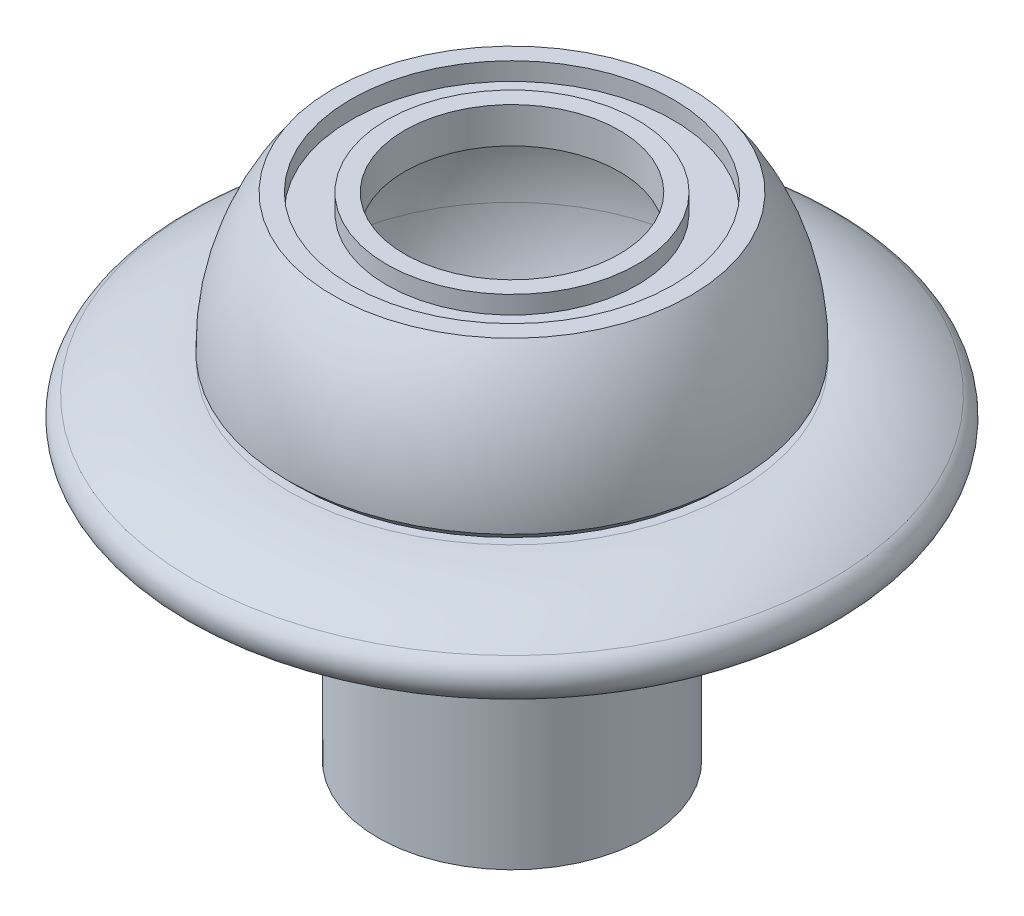
ISO-10303-21;
HEADER;
FILE_DESCRIPTION(('STEP AP214'),'2;1');
FILE_NAME('part.step','',(''),(''),'','','');
FILE_SCHEMA(('AUTOMOTIVE_DESIGN { 1 0 10303 214 1 1 1 1 }'));
ENDSEC;
DATA;
#1=APPLICATION_CONTEXT('core data for automotive mechanical design processes');
#2=APPLICATION_PROTOCOL_DEFINITION('international standard','automotive_design',2000,#1);
#3=PRODUCT_CONTEXT('',#1,'mechanical');
#4=PRODUCT('Part','Part','',(#3));
#5=PRODUCT_RELATED_PRODUCT_CATEGORY('part','',(#4));
#6=PRODUCT_DEFINITION_FORMATION('','',#4);
#7=PRODUCT_DEFINITION_CONTEXT('part definition',#1,'design');
#8=PRODUCT_DEFINITION('design','',#6,#7);
#9=PRODUCT_DEFINITION_SHAPE('','',#8);
#10=(LENGTH_UNIT() NAMED_UNIT(*) SI_UNIT(.MILLI.,.METRE.));
#11=(NAMED_UNIT(*) PLANE_ANGLE_UNIT() SI_UNIT($,.RADIAN.));
#12=(NAMED_UNIT(*) SI_UNIT($,.STERADIAN.) SOLID_ANGLE_UNIT());
#13=UNCERTAINTY_MEASURE_WITH_UNIT(LENGTH_MEASURE(1.E-05),#10,'distance_accuracy_value','');
#14=(GEOMETRIC_REPRESENTATION_CONTEXT(3) GLOBAL_UNCERTAINTY_ASSIGNED_CONTEXT((#13)) GLOBAL_UNIT_ASSIGNED_CONTEXT((#10,
#11,#12)) REPRESENTATION_CONTEXT('',''));
#15=CARTESIAN_POINT('',(0.,0.,0.));
#16=DIRECTION('',(0.,0.,1.));
#17=DIRECTION('',(1.,0.,0.));
#18=AXIS2_PLACEMENT_3D('',#15,#16,#17);
#19=CARTESIAN_POINT('',(0.,-1.49798647889359,0.));
#20=DIRECTION('',(0.,1.,0.));
#21=DIRECTION('',(0.,0.,1.));
#22=AXIS2_PLACEMENT_3D('',#19,#20,#21);
#23=PLANE('',#22);
#24=CARTESIAN_POINT('',(0.,-1.49798647889359,0.));
#25=DIRECTION('',(0.,1.,0.));
#26=DIRECTION('',(0.,0.,1.));
#27=AXIS2_PLACEMENT_3D('',#24,#25,#26);
#28=CIRCLE('',#27,23.9550803747263);
#29=CARTESIAN_POINT('',(0.,-1.49798647889359,23.9550803747263));
#30=VERTEX_POINT('',#29);
#31=EDGE_CURVE('E12',#30,#30,#28,.F.);
#32=ORIENTED_EDGE('',*,*,#31,.T.);
#33=EDGE_LOOP('',(#32));
#34=FACE_BOUND('',#33,.T.);
#35=CARTESIAN_POINT('',(0.,-1.49798647889359,0.));
#36=DIRECTION('',(0.,1.,0.));
#37=DIRECTION('',(0.,0.,1.));
#38=AXIS2_PLACEMENT_3D('',#35,#36,#37);
#39=CIRCLE('',#38,21.9489415806105);
#40=CARTESIAN_POINT('',(-21.9489415806105,-1.49798647889359,0.));
#41=VERTEX_POINT('',#40);
#42=EDGE_CURVE('E63',#41,#41,#39,.F.);
#43=ORIENTED_EDGE('',*,*,#42,.F.);
#44=EDGE_LOOP('',(#43));
#45=FACE_BOUND('',#44,.T.);
#46=ADVANCED_FACE('F52',(#34,#45),#23,.F.);
#47=CARTESIAN_POINT('',(0.,20.6981454974278,0.));
#48=DIRECTION('',(0.,1.,0.));
#49=DIRECTION('',(0.,0.,1.));
#50=AXIS2_PLACEMENT_3D('',#47,#48,#49);
#51=CYLINDRICAL_SURFACE('',#50,14.);
#52=CARTESIAN_POINT('',(0.,15.,0.));
#53=DIRECTION('',(0.,1.,0.));
#54=DIRECTION('',(-1.,0.,0.));
#55=AXIS2_PLACEMENT_3D('',#52,#53,#54);
#56=CIRCLE('',#55,14.);
#57=CARTESIAN_POINT('',(-14.,15.,0.));
#58=VERTEX_POINT('',#57);
#59=EDGE_CURVE('E70',#58,#58,#56,.F.);
#60=ORIENTED_EDGE('',*,*,#59,.T.);
#61=EDGE_LOOP('',(#60));
#62=FACE_BOUND('',#61,.T.);
#63=CARTESIAN_POINT('',(0.,13.,0.));
#64=DIRECTION('',(0.,1.,0.));
#65=DIRECTION('',(0.,0.,1.));
#66=AXIS2_PLACEMENT_3D('',#63,#64,#65);
#67=CIRCLE('',#66,14.);
#68=CARTESIAN_POINT('',(0.,13.,14.));
#69=VERTEX_POINT('',#68);
#70=EDGE_CURVE('E84',#69,#69,#67,.T.);
#71=ORIENTED_EDGE('',*,*,#70,.T.);
#72=EDGE_LOOP('',(#71));
#73=FACE_BOUND('',#72,.T.);
#74=ADVANCED_FACE('F104',(#62,#73),#51,.T.);
#75=CARTESIAN_POINT('',(-18.,13.,0.));
#76=DIRECTION('',(0.,-1.,0.));
#77=DIRECTION('',(0.,0.,-1.));
#78=AXIS2_PLACEMENT_3D('',#75,#76,#77);
#79=PLANE('',#78);
#80=ORIENTED_EDGE('',*,*,#70,.F.);
#81=EDGE_LOOP('',(#80));
#82=FACE_BOUND('',#81,.T.);
#83=CARTESIAN_POINT('',(0.,13.,0.));
#84=DIRECTION('',(0.,1.,0.));
#85=DIRECTION('',(0.,0.,1.));
#86=AXIS2_PLACEMENT_3D('',#83,#84,#85);
#87=CIRCLE('',#86,18.);
#88=CARTESIAN_POINT('',(0.,13.,18.));
#89=VERTEX_POINT('',#88);
#90=EDGE_CURVE('E77',#89,#89,#87,.T.);
#91=ORIENTED_EDGE('',*,*,#90,.T.);
#92=EDGE_LOOP('',(#91));
#93=FACE_BOUND('',#92,.T.);
#94=ADVANCED_FACE('F107',(#82,#93),#79,.F.);
#95=CARTESIAN_POINT('',(0.,20.6981454974278,0.));
#96=DIRECTION('',(0.,1.,0.));
#97=DIRECTION('',(0.,0.,1.));
#98=AXIS2_PLACEMENT_3D('',#95,#96,#97);
#99=CYLINDRICAL_SURFACE('',#98,18.);
#100=CARTESIAN_POINT('',(0.,15.,0.));
#101=DIRECTION('',(0.,1.,0.));
#102=DIRECTION('',(-1.,0.,0.));
#103=AXIS2_PLACEMENT_3D('',#100,#101,#102);
#104=CIRCLE('',#103,18.);
#105=CARTESIAN_POINT('',(-18.,15.,0.));
#106=VERTEX_POINT('',#105);
#107=EDGE_CURVE('E74',#106,#106,#104,.T.);
#108=ORIENTED_EDGE('',*,*,#107,.T.);
#109=EDGE_LOOP('',(#108));
#110=FACE_BOUND('',#109,.T.);
#111=ORIENTED_EDGE('',*,*,#90,.F.);
#112=EDGE_LOOP('',(#111));
#113=FACE_BOUND('',#112,.T.);
#114=ADVANCED_FACE('F113',(#110,#113),#99,.F.);
#115=CARTESIAN_POINT('',(-20.,15.,0.));
#116=DIRECTION('',(0.,1.,0.));
#117=DIRECTION('',(-1.,0.,0.));
#118=AXIS2_PLACEMENT_3D('',#115,#116,#117);
#119=PLANE('',#118);
#120=ORIENTED_EDGE('',*,*,#107,.F.);
#121=EDGE_LOOP('',(#120));
#122=FACE_BOUND('',#121,.T.);
#123=CARTESIAN_POINT('',(0.,15.,0.));
#124=DIRECTION('',(0.,1.,0.));
#125=DIRECTION('',(-1.,0.,0.));
#126=AXIS2_PLACEMENT_3D('',#123,#124,#125);
#127=CIRCLE('',#126,20.);
#128=CARTESIAN_POINT('',(-20.,15.,0.));
#129=VERTEX_POINT('',#128);
#130=EDGE_CURVE('E67',#129,#129,#127,.T.);
#131=ORIENTED_EDGE('',*,*,#130,.T.);
#132=EDGE_LOOP('',(#131));
#133=FACE_BOUND('',#132,.T.);
#134=ADVANCED_FACE('F101',(#122,#133),#119,.T.);
#135=CARTESIAN_POINT('',(0.,0.,0.));
#136=DIRECTION('',(0.,1.,0.));
#137=DIRECTION('',(-1.,0.,0.));
#138=AXIS2_PLACEMENT_3D('',#135,#136,#137);
#139=SPHERICAL_SURFACE('',#138,25.);
#140=CARTESIAN_POINT('',(0.,-0.457248731429853,0.));
#141=DIRECTION('',(0.,1.,0.));
#142=DIRECTION('',(0.,0.,1.));
#143=AXIS2_PLACEMENT_3D('',#140,#141,#142);
#144=CIRCLE('',#143,24.9958181221901);
#145=CARTESIAN_POINT('',(-24.9958181221901,-0.457248731429853,0.));
#146=VERTEX_POINT('',#145);
#147=EDGE_CURVE('E59',#146,#146,#144,.T.);
#148=CARTESIAN_POINT('',(-24.9958181221901,-0.457248731429853,0.));
#149=CARTESIAN_POINT('',(-24.9989705166182,-0.284935872463204,0.));
#150=CARTESIAN_POINT('',(-25.0003405721152,-0.112590418959888,0.));
#151=CARTESIAN_POINT('',(-24.9995166214743,0.232091969804561,0.));
#152=CARTESIAN_POINT('',(-24.9973226153363,0.404428905065694,0.));
#153=CARTESIAN_POINT('',(-24.9893711576524,0.74902055003026,0.));
#154=CARTESIAN_POINT('',(-24.9836137061064,0.921275259733693,0.));
#155=CARTESIAN_POINT('',(-24.9685379063162,1.26562878241046,0.));
#156=CARTESIAN_POINT('',(-24.9592195580718,1.43772759538379,0.));
#157=CARTESIAN_POINT('',(-24.9370259271086,1.78169571984165,0.));
#158=CARTESIAN_POINT('',(-24.9241506443898,1.95356503132617,0.));
#159=CARTESIAN_POINT('',(-24.8948486572865,2.29700064627295,0.));
#160=CARTESIAN_POINT('',(-24.878421952902,2.46856694973521,0.));
#161=CARTESIAN_POINT('',(-24.8420241463216,2.81132317167833,0.));
#162=CARTESIAN_POINT('',(-24.8220530441255,2.98251309015918,0.));
#163=CARTESIAN_POINT('',(-24.7785749837799,3.32444332616094,0.));
#164=CARTESIAN_POINT('',(-24.7550680256303,3.49518364368184,0.));
#165=CARTESIAN_POINT('',(-24.7045283069167,3.83614165407302,0.));
#166=CARTESIAN_POINT('',(-24.6774955463528,4.0063593469433,0.));
#167=CARTESIAN_POINT('',(-24.6199157844465,4.34619930786352,0.));
#168=CARTESIAN_POINT('',(-24.5893687831041,4.51582157591346,0.));
#169=CARTESIAN_POINT('',(-24.5247736042372,4.85439814167964,0.));
#170=CARTESIAN_POINT('',(-24.4907254267126,5.02335243939588,0.));
#171=CARTESIAN_POINT('',(-24.4191424575016,5.36052080466459,0.));
#172=CARTESIAN_POINT('',(-24.3816076658151,5.52873487221707,0.));
#173=CARTESIAN_POINT('',(-24.3030675214828,5.86435083391623,0.));
#174=CARTESIAN_POINT('',(-24.262062168837,6.03175272806292,0.));
#175=CARTESIAN_POINT('',(-24.1765984401087,6.36567274706578,0.));
#176=CARTESIAN_POINT('',(-24.1321400640263,6.53219087192196,0.));
#177=CARTESIAN_POINT('',(-24.0397893027662,6.86427213443716,0.));
#178=CARTESIAN_POINT('',(-23.9918969175886,7.02983527209618,0.));
#179=CARTESIAN_POINT('',(-23.8926986211661,7.35993575074757,0.));
#180=CARTESIAN_POINT('',(-23.8413927099213,7.52447309173994,0.));
#181=CARTESIAN_POINT('',(-23.7353893043186,7.8524516063101,0.));
#182=CARTESIAN_POINT('',(-23.6806918099608,8.01589277988788,0.));
#183=CARTESIAN_POINT('',(-23.5679286316281,8.34160905769926,0.));
#184=CARTESIAN_POINT('',(-23.5098629476531,8.50388416193286,0.));
#185=CARTESIAN_POINT('',(-23.3903882241181,8.82719889784082,0.));
#186=CARTESIAN_POINT('',(-23.3289791845581,8.98823852951519,0.));
#187=CARTESIAN_POINT('',(-23.2028440138002,9.30901344548726,0.));
#188=CARTESIAN_POINT('',(-23.1381178826023,9.46874872978496,0.));
#189=CARTESIAN_POINT('',(-23.0053762111983,9.78684663404065,0.));
#190=CARTESIAN_POINT('',(-22.9373606709922,9.94520925399864,0.));
#191=CARTESIAN_POINT('',(-22.7980692710443,10.2604940996852,0.));
#192=CARTESIAN_POINT('',(-22.7267934113027,10.4174163254138,0.));
#193=CARTESIAN_POINT('',(-22.581011856156,10.7297532687905,0.));
#194=CARTESIAN_POINT('',(-22.506506160751,10.8851679864386,0.));
#195=CARTESIAN_POINT('',(-22.3542967995223,11.1944234445534,0.));
#196=CARTESIAN_POINT('',(-22.2765931336987,11.3482641850202,0.));
#197=CARTESIAN_POINT('',(-22.1180210645804,11.6543058928201,0.));
#198=CARTESIAN_POINT('',(-22.0371526612857,11.8065068601533,0.));
#199=CARTESIAN_POINT('',(-21.8722857038177,12.1092039271342,0.));
#200=CARTESIAN_POINT('',(-21.7882871496444,12.259700026782,0.));
#201=CARTESIAN_POINT('',(-21.6171958152833,12.5589229926639,0.));
#202=CARTESIAN_POINT('',(-21.5301030350955,12.7076498588979,0.));
#203=CARTESIAN_POINT('',(-21.3528604986449,13.003270750133,0.));
#204=CARTESIAN_POINT('',(-21.2627107423821,13.1501647751341,0.));
#205=CARTESIAN_POINT('',(-21.0793928047727,13.4420571553858,0.));
#206=CARTESIAN_POINT('',(-20.9862246234261,13.5870555106365,0.));
#207=CARTESIAN_POINT('',(-20.7969097014048,13.8750945507323,0.));
#208=CARTESIAN_POINT('',(-20.7007629607302,14.0181352355774,0.));
#209=CARTESIAN_POINT('',(-20.5055319708127,14.3021977076403,0.));
#210=CARTESIAN_POINT('',(-20.4064477215699,14.4432194948582,0.));
#211=CARTESIAN_POINT('',(-20.2053843533636,14.7231840461581,0.));
#212=CARTESIAN_POINT('',(-20.1034052344001,14.8621268102401,0.));
#213=CARTESIAN_POINT('',(-20.,15.,0.));
#214=B_SPLINE_CURVE_WITH_KNOTS('',3,(#148,#149,#150,#151,#152,#153,#154,#155,#156,#157,#158,
#159,#160,#161,#162,#163,#164,#165,#166,#167,#168,#169,#170,#171,#172,#173,#174,#175,#176,#177,
#178,#179,#180,#181,#182,#183,#184,#185,#186,#187,#188,#189,#190,#191,#192,#193,#194,#195,#196,
#197,#198,#199,#200,#201,#202,#203,#204,#205,#206,#207,#208,#209,#210,#211,#212,#213),
.UNSPECIFIED.,.F.,.F.,(4,2,2,2,2,2,2,2,2,2,2,2,2,2,2,2,2,2,2,2,2,2,2,2,2,2,2,2,2,2,2,2,4),(0.,
0.517015847036513,1.03403169407303,1.55104754110954,2.06806338814605,2.58507923518256,
3.10209508221908,3.61911092925559,4.1361267762921,4.65314262332862,5.17015847036513,
5.68717431740164,6.20419016443816,6.72120601147467,7.23822185851118,7.75523770554769,
8.27225355258421,8.78926939962072,9.30628524665723,9.82330109369375,10.3403169407303,
10.8573327877668,11.3743486348033,11.8913644818398,12.4083803288763,12.9253961759128,
13.4424120229493,13.9594278699858,14.4764437170224,14.9934595640589,15.5104754110954,
16.0274912581319,16.5445071051684),.UNSPECIFIED.);
#215=EDGE_CURVE('BSEAM99',#146,#129,#214,.T.);
#216=ORIENTED_EDGE('',*,*,#147,.T.);
#217=ORIENTED_EDGE('',*,*,#130,.F.);
#218=ORIENTED_EDGE('',*,*,#215,.T.);
#219=ORIENTED_EDGE('',*,*,#215,.F.);
#220=EDGE_LOOP('',(#216,#218,#217,#219));
#221=FACE_BOUND('',#220,.T.);
#222=ADVANCED_FACE('F99',(#221),#139,.T.);
#223=CARTESIAN_POINT('',(0.,15.,0.));
#224=DIRECTION('',(0.,1.,0.));
#225=DIRECTION('',(-1.,0.,0.));
#226=AXIS2_PLACEMENT_3D('',#223,#224,#225);
#227=CIRCLE('',#226,12.);
#228=CARTESIAN_POINT('',(-12.,15.,0.));
#229=VERTEX_POINT('',#228);
#230=EDGE_CURVE('E90',#229,#229,#227,.T.);
#231=ORIENTED_EDGE('',*,*,#230,.F.);
#232=EDGE_LOOP('',(#231));
#233=FACE_BOUND('',#232,.T.);
#234=ORIENTED_EDGE('',*,*,#59,.F.);
#235=EDGE_LOOP('',(#234));
#236=FACE_BOUND('',#235,.T.);
#237=ADVANCED_FACE('F96',(#233,#236),#119,.T.);
#238=CARTESIAN_POINT('',(0.,-22.9411254969543,0.));
#239=DIRECTION('',(0.,1.,0.));
#240=DIRECTION('',(-1.,0.,0.));
#241=AXIS2_PLACEMENT_3D('',#238,#239,#240);
#242=CYLINDRICAL_SURFACE('',#241,12.);
#243=CARTESIAN_POINT('',(0.,11.,0.));
#244=DIRECTION('',(0.,1.,0.));
#245=DIRECTION('',(-1.,0.,0.));
#246=AXIS2_PLACEMENT_3D('',#243,#244,#245);
#247=CIRCLE('',#246,12.);
#248=CARTESIAN_POINT('',(-12.,11.,0.));
#249=VERTEX_POINT('',#248);
#250=EDGE_CURVE('E87',#249,#249,#247,.F.);
#251=ORIENTED_EDGE('',*,*,#250,.T.);
#252=EDGE_LOOP('',(#251));
#253=FACE_BOUND('',#252,.T.);
#254=ORIENTED_EDGE('',*,*,#230,.T.);
#255=EDGE_LOOP('',(#254));
#256=FACE_BOUND('',#255,.T.);
#257=ADVANCED_FACE('F94',(#253,#256),#242,.F.);
#258=CARTESIAN_POINT('',(-20.,11.,0.));
#259=DIRECTION('',(0.,1.,0.));
#260=DIRECTION('',(-1.,0.,0.));
#261=AXIS2_PLACEMENT_3D('',#258,#259,#260);
#262=PLANE('',#261);
#263=ORIENTED_EDGE('',*,*,#250,.F.);
#264=EDGE_LOOP('',(#263));
#265=FACE_BOUND('',#264,.T.);
#266=CARTESIAN_POINT('',(0.,11.,0.));
#267=DIRECTION('',(0.,1.,0.));
#268=DIRECTION('',(-1.,0.,0.));
#269=AXIS2_PLACEMENT_3D('',#266,#267,#268);
#270=CIRCLE('',#269,19.0525588832577);
#271=CARTESIAN_POINT('',(-19.0525588832577,11.,0.));
#272=VERTEX_POINT('',#271);
#273=EDGE_CURVE('E73',#272,#272,#270,.T.);
#274=ORIENTED_EDGE('',*,*,#273,.F.);
#275=EDGE_LOOP('',(#274));
#276=FACE_BOUND('',#275,.T.);
#277=ADVANCED_FACE('F130',(#265,#276),#262,.F.);
#278=CARTESIAN_POINT('',(0.,0.,0.));
#279=DIRECTION('',(0.,1.,0.));
#280=DIRECTION('',(-1.,0.,0.));
#281=AXIS2_PLACEMENT_3D('',#278,#279,#280);
#282=SPHERICAL_SURFACE('',#281,22.);
#283=CARTESIAN_POINT('',(-21.9489415806105,-1.49798647889359,0.));
#284=CARTESIAN_POINT('',(-21.9581752886266,-1.3626937149652,0.));
#285=CARTESIAN_POINT('',(-21.9661577823366,-1.22731556224396,0.));
#286=CARTESIAN_POINT('',(-21.9796182870077,-0.956434804223561,0.));
#287=CARTESIAN_POINT('',(-21.9850962979688,-0.820932198924397,0.));
#288=CARTESIAN_POINT('',(-21.9935457830053,-0.549848860755922,0.));
#289=CARTESIAN_POINT('',(-21.9965172570808,-0.41426812788661,0.));
#290=CARTESIAN_POINT('',(-21.9999527007673,-0.143074897703416,0.));
#291=CARTESIAN_POINT('',(-22.0004166703784,-0.00746240038953348,0.));
#292=CARTESIAN_POINT('',(-21.9988369334921,0.263747987750982,0.));
#293=CARTESIAN_POINT('',(-21.9967932269947,0.399345878577615,0.));
#294=CARTESIAN_POINT('',(-21.9901988402018,0.670480686987703,0.));
#295=CARTESIAN_POINT('',(-21.9856481599062,0.806017604571159,0.));
#296=CARTESIAN_POINT('',(-21.9740413806515,1.07698412080762,0.));
#297=CARTESIAN_POINT('',(-21.9669852816925,1.21241371946064,0.));
#298=CARTESIAN_POINT('',(-21.9503700781359,1.48311928878699,0.));
#299=CARTESIAN_POINT('',(-21.9408109735383,1.61839525946034,0.));
#300=CARTESIAN_POINT('',(-21.9191930272949,1.88874731632572,0.));
#301=CARTESIAN_POINT('',(-21.907134185649,2.02382340251776,0.));
#302=CARTESIAN_POINT('',(-21.8805208887485,2.29372950226351,0.));
#303=CARTESIAN_POINT('',(-21.8659664334939,2.42855951581723,0.));
#304=CARTESIAN_POINT('',(-21.8343668861474,2.69792736627296,0.));
#305=CARTESIAN_POINT('',(-21.8173217940555,2.83246520317498,0.));
#306=CARTESIAN_POINT('',(-21.7807468014646,3.10120269622106,0.));
#307=CARTESIAN_POINT('',(-21.7612169009656,3.23540235236512,0.));
#308=CARTESIAN_POINT('',(-21.719678969649,3.50341759542722,0.));
#309=CARTESIAN_POINT('',(-21.6976709388314,3.63723318234525,0.));
#310=CARTESIAN_POINT('',(-21.6511842723427,3.90443452981653,0.));
#311=CARTESIAN_POINT('',(-21.6267056366716,4.03782029036977,0.));
#312=CARTESIAN_POINT('',(-21.5752861307438,4.30411637494828,0.));
#313=CARTESIAN_POINT('',(-21.5483452604871,4.43702669897355,0.));
#314=CARTESIAN_POINT('',(-21.4920104975973,4.70232646290454,0.));
#315=CARTESIAN_POINT('',(-21.462616604964,4.83471590281027,0.));
#316=CARTESIAN_POINT('',(-21.4013858483206,5.09892862902264,0.));
#317=CARTESIAN_POINT('',(-21.3695489843104,5.23075191532929,0.));
#318=CARTESIAN_POINT('',(-21.3034431712668,5.49378725845554,0.));
#319=CARTESIAN_POINT('',(-21.2691742222334,5.62499931527515,0.));
#320=CARTESIAN_POINT('',(-21.1982159571284,5.88676733254424,0.));
#321=CARTESIAN_POINT('',(-21.1615266410568,6.01732329299372,0.));
#322=CARTESIAN_POINT('',(-21.0857401874853,6.27773447498626,0.));
#323=CARTESIAN_POINT('',(-21.0466430499853,6.40758969652932,0.));
#324=CARTESIAN_POINT('',(-20.9660543225013,6.66655499778453,0.));
#325=CARTESIAN_POINT('',(-20.9245627325173,6.7956650774967,0.));
#326=CARTESIAN_POINT('',(-20.8391992877732,7.053095946961,0.));
#327=CARTESIAN_POINT('',(-20.7953274330132,7.18141673671314,0.));
#328=CARTESIAN_POINT('',(-20.7052184603358,7.43722514801867,0.));
#329=CARTESIAN_POINT('',(-20.6589813424183,7.56471276957207,0.));
#330=CARTESIAN_POINT('',(-20.5641576538322,7.81881125113936,0.));
#331=CARTESIAN_POINT('',(-20.5155710831636,7.94542211115326,0.));
#332=CARTESIAN_POINT('',(-20.4160651028374,8.19772377609118,0.));
#333=CARTESIAN_POINT('',(-20.3651456931798,8.32341458101519,0.));
#334=CARTESIAN_POINT('',(-20.2609914464075,8.57383315686937,0.));
#335=CARTESIAN_POINT('',(-20.2077566092928,8.69856092779953,0.));
#336=CARTESIAN_POINT('',(-20.0989897106017,8.94701078591002,0.));
#337=CARTESIAN_POINT('',(-20.0434576490254,9.07073287309034,0.));
#338=CARTESIAN_POINT('',(-19.9301152909598,9.31712905840354,0.));
#339=CARTESIAN_POINT('',(-19.8723049944707,9.43980315653641,0.));
#340=CARTESIAN_POINT('',(-19.7544259312841,9.68406141466953,0.));
#341=CARTESIAN_POINT('',(-19.6943571645868,9.80564557466977,0.));
#342=CARTESIAN_POINT('',(-19.5719817123892,10.0476823881299,0.));
#343=CARTESIAN_POINT('',(-19.509675026889,10.1681350415899,0.));
#344=CARTESIAN_POINT('',(-19.382844999855,10.4078676306814,0.));
#345=CARTESIAN_POINT('',(-19.3183216583213,10.5271475663129,0.));
#346=CARTESIAN_POINT('',(-19.1870805410174,10.7644940206377,0.));
#347=CARTESIAN_POINT('',(-19.1203627652473,10.8825605393309,0.));
#348=CARTESIAN_POINT('',(-19.0525588832577,11.,0.));
#349=B_SPLINE_CURVE_WITH_KNOTS('',3,(#283,#284,#285,#286,#287,#288,#289,#290,#291,#292,#293,
#294,#295,#296,#297,#298,#299,#300,#301,#302,#303,#304,#305,#306,#307,#308,#309,#310,#311,#312,
#313,#314,#315,#316,#317,#318,#319,#320,#321,#322,#323,#324,#325,#326,#327,#328,#329,#330,#331,
#332,#333,#334,#335,#336,#337,#338,#339,#340,#341,#342,#343,#344,#345,#346,#347,#348),
.UNSPECIFIED.,.F.,.F.,(4,2,2,2,2,2,2,2,2,2,2,2,2,2,2,2,2,2,2,2,2,2,2,2,2,2,2,2,2,2,2,2,4),(0.,
0.406816687372371,0.813633374744741,1.22045006211711,1.62726674948948,2.03408343686185,
2.44090012423422,2.8477168116066,3.25453349897897,3.66135018635134,4.06816687372371,
4.47498356109608,4.88180024846845,5.28861693584082,5.69543362321319,6.10225031058556,
6.50906699795793,6.9158836853303,7.32270037270267,7.72951706007504,8.13633374744741,
8.54315043481978,8.94996712219215,9.35678380956453,9.7636004969369,10.1704171843093,
10.5772338716816,10.984050559054,11.3908672464264,11.7976839337987,12.2045006211711,
12.6113173085435,13.0181339959159),.UNSPECIFIED.);
#350=EDGE_CURVE('BSEAM125',#41,#272,#349,.T.);
#351=ORIENTED_EDGE('',*,*,#42,.T.);
#352=ORIENTED_EDGE('',*,*,#273,.T.);
#353=ORIENTED_EDGE('',*,*,#350,.T.);
#354=ORIENTED_EDGE('',*,*,#350,.F.);
#355=EDGE_LOOP('',(#351,#353,#352,#354));
#356=FACE_BOUND('',#355,.T.);
#357=ADVANCED_FACE('F125',(#356),#282,.F.);
#358=CARTESIAN_POINT('',(0.,-0.457248731429853,0.));
#359=DIRECTION('',(0.,1.,0.));
#360=DIRECTION('',(0.,0.,1.));
#361=AXIS2_PLACEMENT_3D('',#358,#359,#360);
#362=CONICAL_SURFACE('',#361,24.9958181221901,0.785398163397453);
#363=ORIENTED_EDGE('',*,*,#31,.F.);
#364=EDGE_LOOP('',(#363));
#365=FACE_BOUND('',#364,.T.);
#366=ORIENTED_EDGE('',*,*,#147,.F.);
#367=EDGE_LOOP('',(#366));
#368=FACE_BOUND('',#367,.T.);
#369=ADVANCED_FACE('F54',(#365,#368),#362,.T.);
#370=CLOSED_SHELL('',(#46,#74,#94,#114,#134,#222,#237,#257,#277,#357,#369));
#371=MANIFOLD_SOLID_BREP('B2',#370);
#372=CARTESIAN_POINT('',(0.,-1.49798647889359,0.));
#373=DIRECTION('',(0.,1.,0.));
#374=DIRECTION('',(0.,0.,1.));
#375=AXIS2_PLACEMENT_3D('',#372,#373,#374);
#376=PLANE('',#375);
#377=CARTESIAN_POINT('',(0.,-1.49798647889359,0.));
#378=DIRECTION('',(0.,1.,0.));
#379=DIRECTION('',(0.,0.,1.));
#380=AXIS2_PLACEMENT_3D('',#377,#378,#379);
#381=CIRCLE('',#380,21.9489415806105);
#382=CARTESIAN_POINT('',(-21.9489415806105,-1.49798647889359,0.));
#383=VERTEX_POINT('',#382);
#384=EDGE_CURVE('E233',#383,#383,#381,.F.);
#385=ORIENTED_EDGE('',*,*,#384,.T.);
#386=EDGE_LOOP('',(#385));
#387=FACE_BOUND('',#386,.T.);
#388=CARTESIAN_POINT('',(0.,-1.49798647889359,0.));
#389=DIRECTION('',(0.,1.,0.));
#390=DIRECTION('',(0.,0.,1.));
#391=AXIS2_PLACEMENT_3D('',#388,#389,#390);
#392=CIRCLE('',#391,24.9550803747263);
#393=CARTESIAN_POINT('',(0.,-1.49798647889359,24.9550803747263));
#394=VERTEX_POINT('',#393);
#395=EDGE_CURVE('E221',#394,#394,#392,.T.);
#396=ORIENTED_EDGE('',*,*,#395,.T.);
#397=EDGE_LOOP('',(#396));
#398=FACE_BOUND('',#397,.T.);
#399=ADVANCED_FACE('F217',(#387,#398),#376,.T.);
#400=CARTESIAN_POINT('',(0.,0.,0.));
#401=DIRECTION('',(0.,1.,0.));
#402=DIRECTION('',(-1.,0.,0.));
#403=AXIS2_PLACEMENT_3D('',#400,#401,#402);
#404=SPHERICAL_SURFACE('',#403,22.);
#405=CARTESIAN_POINT('',(0.,-18.4390889145858,0.));
#406=DIRECTION('',(0.,1.,0.));
#407=DIRECTION('',(-1.,0.,0.));
#408=AXIS2_PLACEMENT_3D('',#405,#406,#407);
#409=CIRCLE('',#408,12.);
#410=CARTESIAN_POINT('',(-12.,-18.4390889145858,0.));
#411=VERTEX_POINT('',#410);
#412=EDGE_CURVE('E268',#411,#411,#409,.T.);
#413=CARTESIAN_POINT('',(-12.,-18.4390889145858,0.));
#414=CARTESIAN_POINT('',(-12.177807499258,-18.3233744277765,0.));
#415=CARTESIAN_POINT('',(-12.3539402199147,-18.2050865763757,0.));
#416=CARTESIAN_POINT('',(-12.7027110194208,-17.9634664589658,0.));
#417=CARTESIAN_POINT('',(-12.8753490982701,-17.8401341929566,0.));
#418=CARTESIAN_POINT('',(-13.2169855295567,-17.5885275609046,0.));
#419=CARTESIAN_POINT('',(-13.3859838819939,-17.4602531948618,0.));
#420=CARTESIAN_POINT('',(-13.7201996052237,-17.1988699440362,0.));
#421=CARTESIAN_POINT('',(-13.8854169760164,-17.0657610592535,0.));
#422=CARTESIAN_POINT('',(-14.2119324347566,-16.7948200947807,0.));
#423=CARTESIAN_POINT('',(-14.3732305227041,-16.6569880150906,0.));
#424=CARTESIAN_POINT('',(-14.6917724505377,-16.376716018297,0.));
#425=CARTESIAN_POINT('',(-14.8490162904238,-16.2342761011934,0.));
#426=CARTESIAN_POINT('',(-15.1593181345106,-15.9449076212272,0.));
#427=CARTESIAN_POINT('',(-15.3123761387112,-15.7979790583647,0.));
#428=CARTESIAN_POINT('',(-15.614178230624,-15.4997562405439,0.));
#429=CARTESIAN_POINT('',(-15.7629223183362,-15.3484619855858,0.));
#430=CARTESIAN_POINT('',(-16.0559721053484,-15.0416343889639,0.));
#431=CARTESIAN_POINT('',(-16.2002778046485,-14.8861010473001,0.));
#432=CARTESIAN_POINT('',(-16.4843300573254,-14.5709254304183,0.));
#433=CARTESIAN_POINT('',(-16.6240766107022,-14.4112831552003,0.));
#434=CARTESIAN_POINT('',(-16.8988936291179,-14.0880232626783,0.));
#435=CARTESIAN_POINT('',(-17.0339640941568,-13.9244056453741,0.));
#436=CARTESIAN_POINT('',(-17.2993159065367,-13.5933319868146,0.));
#437=CARTESIAN_POINT('',(-17.4295972538777,-13.4258759455592,0.));
#438=CARTESIAN_POINT('',(-17.6852618091149,-13.0872655692853,0.));
#439=CARTESIAN_POINT('',(-17.8106450170111,-12.9161112342667,0.));
#440=CARTESIAN_POINT('',(-18.0564083704634,-12.5702474954548,0.));
#441=CARTESIAN_POINT('',(-18.1767885160196,-12.3955380916615,0.));
#442=CARTESIAN_POINT('',(-18.4124450085476,-12.0427104152322,0.));
#443=CARTESIAN_POINT('',(-18.5277213555195,-11.8645921425964,0.));
#444=CARTESIAN_POINT('',(-18.7530737855841,-11.5050957810167,0.));
#445=CARTESIAN_POINT('',(-18.8631498686769,-11.3237176920729,0.));
#446=CARTESIAN_POINT('',(-19.0780096573618,-10.957853478284,0.));
#447=CARTESIAN_POINT('',(-19.1827933629539,-10.7733673534389,0.));
#448=CARTESIAN_POINT('',(-19.3869807117712,-10.4014414491139,0.));
#449=CARTESIAN_POINT('',(-19.4863843549964,-10.2140016696339,0.));
#450=CARTESIAN_POINT('',(-19.6797283963456,-9.83632530897591,0.));
#451=CARTESIAN_POINT('',(-19.7736687944695,-9.64608872779798,0.));
#452=CARTESIAN_POINT('',(-19.9560077346225,-9.26297795709455,0.));
#453=CARTESIAN_POINT('',(-20.0444062766515,-9.07010376756904,0.));
#454=CARTESIAN_POINT('',(-20.2155875311438,-8.68187918071828,0.));
#455=CARTESIAN_POINT('',(-20.2983702436071,-8.48652878339302,0.));
#456=CARTESIAN_POINT('',(-20.4582505649257,-8.09351525362547,0.));
#457=CARTESIAN_POINT('',(-20.5353481737811,-7.89585212118319,0.));
#458=CARTESIAN_POINT('',(-20.6837937712275,-7.49837852920121,0.));
#459=CARTESIAN_POINT('',(-20.7551417598187,-7.29856806966151,0.));
#460=CARTESIAN_POINT('',(-20.8920284115012,-6.89696702842933,0.));
#461=CARTESIAN_POINT('',(-20.9575670745925,-6.69517644673684,0.));
#462=CARTESIAN_POINT('',(-21.082780231251,-6.28978402313185,0.));
#463=CARTESIAN_POINT('',(-21.1424547248181,-6.08618218121935,0.));
#464=CARTESIAN_POINT('',(-21.2558896061514,-5.67733761485121,0.));
#465=CARTESIAN_POINT('',(-21.3096499939177,-5.47209489039556,0.));
#466=CARTESIAN_POINT('',(-21.4112116745102,-5.06014030955344,0.));
#467=CARTESIAN_POINT('',(-21.4590129673364,-4.85342845316697,0.));
#468=CARTESIAN_POINT('',(-21.5486164626454,-4.43870858915867,0.));
#469=CARTESIAN_POINT('',(-21.5904186651283,-4.23070058153684,0.));
#470=CARTESIAN_POINT('',(-21.6679889781462,-3.81356247783009,0.));
#471=CARTESIAN_POINT('',(-21.7037570886812,-3.60443238174516,0.));
#472=CARTESIAN_POINT('',(-21.769229363961,-3.1852251124429,0.));
#473=CARTESIAN_POINT('',(-21.7989335287058,-2.97514793922555,0.));
#474=CARTESIAN_POINT('',(-21.8522527660201,-2.55422228378628,0.));
#475=CARTESIAN_POINT('',(-21.8758678385897,-2.34337380156436,0.));
#476=CARTESIAN_POINT('',(-21.9169902101426,-1.92108207504917,0.));
#477=CARTESIAN_POINT('',(-21.9344975091259,-1.7096388307559,0.));
#478=CARTESIAN_POINT('',(-21.9489415806105,-1.49798647889359,0.));
#479=B_SPLINE_CURVE_WITH_KNOTS('',3,(#413,#414,#415,#416,#417,#418,#419,#420,#421,#422,#423,
#424,#425,#426,#427,#428,#429,#430,#431,#432,#433,#434,#435,#436,#437,#438,#439,#440,#441,#442,
#443,#444,#445,#446,#447,#448,#449,#450,#451,#452,#453,#454,#455,#456,#457,#458,#459,#460,#461,
#462,#463,#464,#465,#466,#467,#468,#469,#470,#471,#472,#473,#474,#475,#476,#477,#478),
.UNSPECIFIED.,.F.,.F.,(4,2,2,2,2,2,2,2,2,2,2,2,2,2,2,2,2,2,2,2,2,2,2,2,2,2,2,2,2,2,2,2,4),(0.,
0.636411657185718,1.27282331437144,1.90923497155715,2.54564662874287,3.18205828592859,
3.81846994311431,4.45488160030003,5.09129325748574,5.72770491467146,6.36411657185718,
7.00052822904289,7.63693988622861,8.27335154341433,8.90976320060005,9.54617485778576,
10.1825865149715,10.8189981721572,11.4554098293429,12.0918214865286,12.7282331437144,
13.3646448009001,14.0010564580858,14.6374681152715,15.2738797724572,15.9102914296429,
16.5467030868287,17.1831147440144,17.8195264012001,18.4559380583858,19.0923497155715,
19.7287613727573,20.365173029943),.UNSPECIFIED.);
#480=EDGE_CURVE('BSEAM219',#411,#383,#479,.T.);
#481=ORIENTED_EDGE('',*,*,#412,.F.);
#482=ORIENTED_EDGE('',*,*,#384,.F.);
#483=ORIENTED_EDGE('',*,*,#480,.T.);
#484=ORIENTED_EDGE('',*,*,#480,.F.);
#485=EDGE_LOOP('',(#481,#483,#482,#484));
#486=FACE_BOUND('',#485,.T.);
#487=ADVANCED_FACE('F219',(#486),#404,.F.);
#488=CARTESIAN_POINT('',(0.,0.,0.));
#489=DIRECTION('',(0.,1.,0.));
#490=DIRECTION('',(-1.,0.,0.));
#491=AXIS2_PLACEMENT_3D('',#488,#489,#490);
#492=SPHERICAL_SURFACE('',#491,25.);
#493=CARTESIAN_POINT('',(0.,-20.,0.));
#494=DIRECTION('',(0.,1.,0.));
#495=DIRECTION('',(-1.,0.,0.));
#496=AXIS2_PLACEMENT_3D('',#493,#494,#495);
#497=CIRCLE('',#496,15.);
#498=CARTESIAN_POINT('',(-15.,-20.,0.));
#499=VERTEX_POINT('',#498);
#500=EDGE_CURVE('E235',#499,#499,#497,.T.);
#501=CARTESIAN_POINT('',(0.,-6.519800750304,0.));
#502=DIRECTION('',(0.,1.,0.));
#503=DIRECTION('',(0.,0.,1.));
#504=AXIS2_PLACEMENT_3D('',#501,#502,#503);
#505=CIRCLE('',#504,24.1348751431686);
#506=CARTESIAN_POINT('',(-24.1348751431686,-6.519800750304,0.));
#507=VERTEX_POINT('',#506);
#508=EDGE_CURVE('E225',#507,#507,#505,.T.);
#509=CARTESIAN_POINT('',(-15.,-20.,0.));
#510=CARTESIAN_POINT('',(-15.1382194797192,-19.8963357357368,0.));
#511=CARTESIAN_POINT('',(-15.2753639932518,-19.7912381997711,0.));
#512=CARTESIAN_POINT('',(-15.547444886638,-19.578222715433,0.));
#513=CARTESIAN_POINT('',(-15.6823812664915,-19.4703047670607,0.));
#514=CARTESIAN_POINT('',(-15.9499876912138,-19.2516945889076,0.));
#515=CARTESIAN_POINT('',(-16.0826577360825,-19.1410023591268,0.));
#516=CARTESIAN_POINT('',(-16.3456745180062,-18.9168912664857,0.));
#517=CARTESIAN_POINT('',(-16.4760212550612,-18.8034724036253,0.));
#518=CARTESIAN_POINT('',(-16.7343353790287,-18.5739567781223,0.));
#519=CARTESIAN_POINT('',(-16.8623027659412,-18.4578600154798,0.));
#520=CARTESIAN_POINT('',(-17.1158031882884,-18.2230384980946,0.));
#521=CARTESIAN_POINT('',(-17.2413362237231,-18.1043137433519,0.));
#522=CARTESIAN_POINT('',(-17.4899139832625,-17.864287272809,0.));
#523=CARTESIAN_POINT('',(-17.6129587073672,-17.7429855570087,0.));
#524=CARTESIAN_POINT('',(-17.8565069552753,-17.4978573047423,0.));
#525=CARTESIAN_POINT('',(-17.9770104790787,-17.3740307682763,0.));
#526=CARTESIAN_POINT('',(-18.2154245293649,-17.1239060998843,0.));
#527=CARTESIAN_POINT('',(-18.3333350558477,-16.9976079679583,0.));
#528=CARTESIAN_POINT('',(-18.5665124291355,-16.7425943963574,0.));
#529=CARTESIAN_POINT('',(-18.6817792759404,-16.6138789566825,0.));
#530=CARTESIAN_POINT('',(-18.9096197438426,-16.3540860963119,0.));
#531=CARTESIAN_POINT('',(-19.0221933649399,-16.2230086756163,0.));
#532=CARTESIAN_POINT('',(-19.2445989930537,-15.9585481952096,0.));
#533=CARTESIAN_POINT('',(-19.3544310000702,-15.8251651354986,0.));
#534=CARTESIAN_POINT('',(-19.571306190096,-15.5561507101144,0.));
#535=CARTESIAN_POINT('',(-19.6783493731053,-15.4205193444412,0.));
#536=CARTESIAN_POINT('',(-19.8896009039326,-15.1470666065929,0.));
#537=CARTESIAN_POINT('',(-19.9938092517505,-15.0092452344179,0.));
#538=CARTESIAN_POINT('',(-20.1993463195291,-14.7314717243732,0.));
#539=CARTESIAN_POINT('',(-20.3006750394898,-14.5915195865035,0.));
#540=CARTESIAN_POINT('',(-20.5004092966605,-14.3095447017602,0.));
#541=CARTESIAN_POINT('',(-20.5988148338706,-14.1675219548865,0.));
#542=CARTESIAN_POINT('',(-20.7926604271406,-13.8814668988512,0.));
#543=CARTESIAN_POINT('',(-20.8881004832004,-13.7374345896896,0.));
#544=CARTESIAN_POINT('',(-21.0759740904458,-13.4474223195799,0.));
#545=CARTESIAN_POINT('',(-21.1684076416313,-13.3014423586318,0.));
#546=CARTESIAN_POINT('',(-21.3502285077123,-13.0075975326248,0.));
#547=CARTESIAN_POINT('',(-21.4396158226079,-12.8597326675658,0.));
#548=CARTESIAN_POINT('',(-21.6153057940806,-12.5621815912151,0.));
#549=CARTESIAN_POINT('',(-21.7016084506578,-12.4124953799233,0.));
#550=CARTESIAN_POINT('',(-21.8710920093671,-12.1113659518683,0.));
#551=CARTESIAN_POINT('',(-21.9542729114993,-11.959922735105,0.));
#552=CARTESIAN_POINT('',(-22.1174772070402,-11.6553443920951,0.));
#553=CARTESIAN_POINT('',(-22.1975006004489,-11.5022092658487,0.));
#554=CARTESIAN_POINT('',(-22.3543554814777,-11.1943129271064,0.));
#555=CARTESIAN_POINT('',(-22.4311869690977,-11.0395517146107,0.));
#556=CARTESIAN_POINT('',(-22.5816250134954,-10.7284697255599,0.));
#557=CARTESIAN_POINT('',(-22.6552315702731,-10.5721489490048,0.));
#558=CARTESIAN_POINT('',(-22.7991881140897,-10.2580150243732,0.));
#559=CARTESIAN_POINT('',(-22.8695381011286,-10.1002018762966,0.));
#560=CARTESIAN_POINT('',(-23.006951266514,-9.78315104267992,0.));
#561=CARTESIAN_POINT('',(-23.0740144448605,-9.62391335713982,0.));
#562=CARTESIAN_POINT('',(-23.2048251661542,-9.30408189481389,0.));
#563=CARTESIAN_POINT('',(-23.2685727091014,-9.14348811802806,0.));
#564=CARTESIAN_POINT('',(-23.3927247601159,-8.82101350292451,0.));
#565=CARTESIAN_POINT('',(-23.4531292681832,-8.65913266460679,0.));
#566=CARTESIAN_POINT('',(-23.5705692793013,-8.33415350715253,0.));
#567=CARTESIAN_POINT('',(-23.6276047823523,-8.17105518801599,0.));
#568=CARTESIAN_POINT('',(-23.7382822898553,-7.84371118127197,0.));
#569=CARTESIAN_POINT('',(-23.7919242943075,-7.6794654936645,0.));
#570=CARTESIAN_POINT('',(-23.8957916635864,-7.34989732447362,0.));
#571=CARTESIAN_POINT('',(-23.9460170284132,-7.1845748428902,0.));
#572=CARTESIAN_POINT('',(-24.0430298419756,-6.85292423891324,0.));
#573=CARTESIAN_POINT('',(-24.0898172907113,-6.6865961165197,0.));
#574=CARTESIAN_POINT('',(-24.1348751431686,-6.519800750304,0.));
#575=B_SPLINE_CURVE_WITH_KNOTS('',3,(#509,#510,#511,#512,#513,#514,#515,#516,#517,#518,#519,
#520,#521,#522,#523,#524,#525,#526,#527,#528,#529,#530,#531,#532,#533,#534,#535,#536,#537,#538,
#539,#540,#541,#542,#543,#544,#545,#546,#547,#548,#549,#550,#551,#552,#553,#554,#555,#556,#557,
#558,#559,#560,#561,#562,#563,#564,#565,#566,#567,#568,#569,#570,#571,#572,#573,#574),
.UNSPECIFIED.,.F.,.F.,(4,2,2,2,2,2,2,2,2,2,2,2,2,2,2,2,2,2,2,2,2,2,2,2,2,2,2,2,2,2,2,2,4),(0.,
0.518313126951454,1.03662625390291,1.55493938085436,2.07325250780582,2.59156563475728,
3.10987876170873,3.62819188866019,4.14650501561165,4.6648181425631,5.18313126951456,
5.70144439646602,6.21975752341747,6.73807065036893,7.25638377732038,7.77469690427184,
8.29301003122329,8.81132315817475,9.32963628512621,9.84794941207766,10.3662625390291,
10.8845756659806,11.402888792932,11.9212019198835,12.4395150468349,12.9578281737864,
13.4761413007379,13.9944544276893,14.5127675546408,15.0310806815922,15.5493938085437,
16.0677069354951,16.5860200624466),.UNSPECIFIED.);
#576=EDGE_CURVE('BSEAM258',#499,#507,#575,.T.);
#577=ORIENTED_EDGE('',*,*,#500,.T.);
#578=ORIENTED_EDGE('',*,*,#508,.F.);
#579=ORIENTED_EDGE('',*,*,#576,.T.);
#580=ORIENTED_EDGE('',*,*,#576,.F.);
#581=EDGE_LOOP('',(#577,#579,#578,#580));
#582=FACE_BOUND('',#581,.T.);
#583=ADVANCED_FACE('F258',(#582),#492,.T.);
#584=CARTESIAN_POINT('',(0.,15.,0.));
#585=DIRECTION('',(0.,1.,0.));
#586=DIRECTION('',(-1.,0.,0.));
#587=AXIS2_PLACEMENT_3D('',#584,#585,#586);
#588=CYLINDRICAL_SURFACE('',#587,15.);
#589=CARTESIAN_POINT('',(0.,-40.,0.));
#590=DIRECTION('',(0.,1.,0.));
#591=DIRECTION('',(-1.,0.,0.));
#592=AXIS2_PLACEMENT_3D('',#589,#590,#591);
#593=CIRCLE('',#592,15.);
#594=CARTESIAN_POINT('',(-15.,-40.,0.));
#595=VERTEX_POINT('',#594);
#596=EDGE_CURVE('E239',#595,#595,#593,.T.);
#597=ORIENTED_EDGE('',*,*,#596,.T.);
#598=EDGE_LOOP('',(#597));
#599=FACE_BOUND('',#598,.T.);
#600=ORIENTED_EDGE('',*,*,#500,.F.);
#601=EDGE_LOOP('',(#600));
#602=FACE_BOUND('',#601,.T.);
#603=ADVANCED_FACE('F263',(#599,#602),#588,.T.);
#604=CARTESIAN_POINT('',(-15.,-40.,0.));
#605=DIRECTION('',(0.,-1.,0.));
#606=DIRECTION('',(1.,0.,0.));
#607=AXIS2_PLACEMENT_3D('',#604,#605,#606);
#608=PLANE('',#607);
#609=CARTESIAN_POINT('',(0.,-40.,0.));
#610=DIRECTION('',(0.,-1.,0.));
#611=DIRECTION('',(1.,0.,0.));
#612=AXIS2_PLACEMENT_3D('',#609,#610,#611);
#613=CIRCLE('',#612,12.);
#614=CARTESIAN_POINT('',(12.,-40.,0.));
#615=VERTEX_POINT('',#614);
#616=EDGE_CURVE('E270',#615,#615,#613,.F.);
#617=ORIENTED_EDGE('',*,*,#616,.T.);
#618=EDGE_LOOP('',(#617));
#619=FACE_BOUND('',#618,.T.);
#620=ORIENTED_EDGE('',*,*,#596,.F.);
#621=EDGE_LOOP('',(#620));
#622=FACE_BOUND('',#621,.T.);
#623=ADVANCED_FACE('F289',(#619,#622),#608,.T.);
#624=CARTESIAN_POINT('',(0.,15.,0.));
#625=DIRECTION('',(0.,1.,0.));
#626=DIRECTION('',(-1.,0.,0.));
#627=AXIS2_PLACEMENT_3D('',#624,#625,#626);
#628=CYLINDRICAL_SURFACE('',#627,12.);
#629=ORIENTED_EDGE('',*,*,#616,.F.);
#630=EDGE_LOOP('',(#629));
#631=FACE_BOUND('',#630,.T.);
#632=ORIENTED_EDGE('',*,*,#412,.T.);
#633=EDGE_LOOP('',(#632));
#634=FACE_BOUND('',#633,.T.);
#635=ADVANCED_FACE('F283',(#631,#634),#628,.F.);
#636=CARTESIAN_POINT('',(0.,-6.73648177666924,0.));
#637=DIRECTION('',(0.,1.,0.));
#638=DIRECTION('',(0.,0.,1.));
#639=AXIS2_PLACEMENT_3D('',#636,#637,#638);
#640=TOROIDAL_SURFACE('',#639,34.3429749579539,2.5);
#641=CARTESIAN_POINT('',(0.,-4.6276958605912,0.));
#642=DIRECTION('',(0.,1.,0.));
#643=DIRECTION('',(0.,0.,1.));
#644=AXIS2_PLACEMENT_3D('',#641,#642,#643);
#645=CIRCLE('',#644,35.6857414902114);
#646=CARTESIAN_POINT('',(0.,-4.6276958605912,35.6857414902114));
#647=VERTEX_POINT('',#646);
#648=EDGE_CURVE('E51',#647,#647,#645,.T.);
#649=ORIENTED_EDGE('',*,*,#648,.F.);
#650=EDGE_LOOP('',(#649));
#651=FACE_BOUND('',#650,.T.);
#652=CARTESIAN_POINT('',(0.,-8.84526769274728,0.));
#653=DIRECTION('',(0.,1.,0.));
#654=DIRECTION('',(0.,0.,1.));
#655=AXIS2_PLACEMENT_3D('',#652,#653,#654);
#656=CIRCLE('',#655,33.0002084256963);
#657=CARTESIAN_POINT('',(0.,-8.84526769274728,33.0002084256963));
#658=VERTEX_POINT('',#657);
#659=EDGE_CURVE('E230',#658,#658,#656,.T.);
#660=ORIENTED_EDGE('',*,*,#659,.T.);
#661=EDGE_LOOP('',(#660));
#662=FACE_BOUND('',#661,.T.);
#663=ADVANCED_FACE('F252',(#651,#662),#640,.T.);
#664=CARTESIAN_POINT('',(0.,-21.4979831892155,0.));
#665=DIRECTION('',(0.,1.,0.));
#666=DIRECTION('',(0.,0.,1.));
#667=AXIS2_PLACEMENT_3D('',#664,#665,#666);
#668=TOROIDAL_SURFACE('',#667,24.9436092321512,15.);
#669=ORIENTED_EDGE('',*,*,#659,.F.);
#670=EDGE_LOOP('',(#669));
#671=FACE_BOUND('',#670,.T.);
#672=ORIENTED_EDGE('',*,*,#508,.T.);
#673=EDGE_LOOP('',(#672));
#674=FACE_BOUND('',#673,.T.);
#675=ADVANCED_FACE('F247',(#671,#674),#668,.F.);
#676=CARTESIAN_POINT('',(0.,-21.4979831892155,0.));
#677=DIRECTION('',(0.,1.,0.));
#678=DIRECTION('',(0.,0.,1.));
#679=AXIS2_PLACEMENT_3D('',#676,#677,#678);
#680=TOROIDAL_SURFACE('',#679,24.9436092321512,20.);
#681=ORIENTED_EDGE('',*,*,#395,.F.);
#682=EDGE_LOOP('',(#681));
#683=FACE_BOUND('',#682,.T.);
#684=ORIENTED_EDGE('',*,*,#648,.T.);
#685=EDGE_LOOP('',(#684));
#686=FACE_BOUND('',#685,.T.);
#687=ADVANCED_FACE('F245',(#683,#686),#680,.T.);
#688=CLOSED_SHELL('',(#399,#487,#583,#603,#623,#635,#663,#675,#687));
#689=MANIFOLD_SOLID_BREP('B7',#688);
#690=ADVANCED_BREP_SHAPE_REPRESENTATION('',(#18,#371,#689),#14);
#691=SHAPE_DEFINITION_REPRESENTATION(#9,#690);
ENDSEC;
END-ISO-10303-21;
